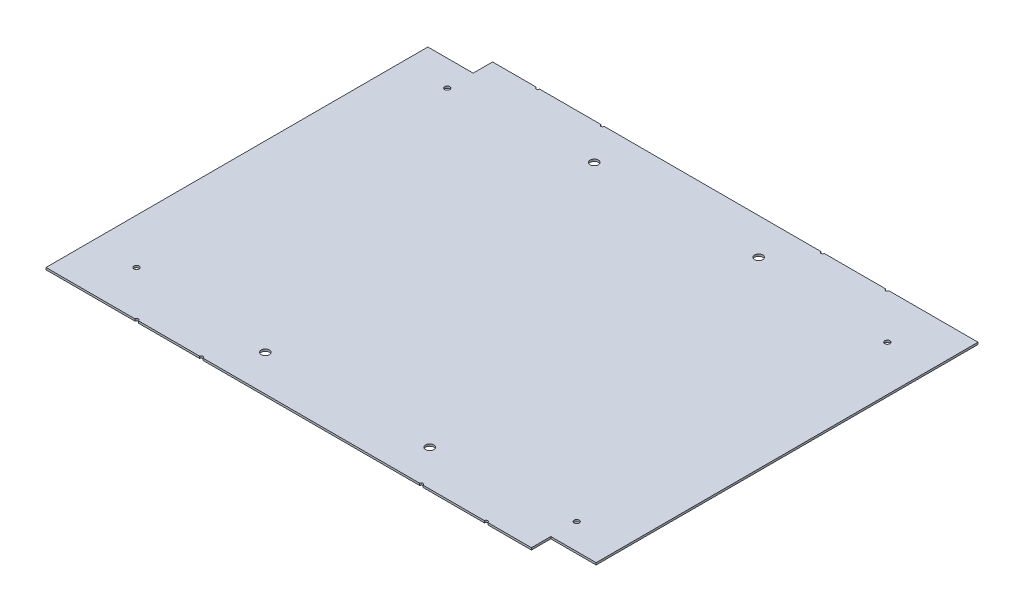
ISO-10303-21;
HEADER;
FILE_DESCRIPTION(('STEP AP214'),'2;1');
FILE_NAME('part.step','',(''),(''),'','','');
FILE_SCHEMA(('AUTOMOTIVE_DESIGN { 1 0 10303 214 1 1 1 1 }'));
ENDSEC;
DATA;
#1=APPLICATION_CONTEXT('core data for automotive mechanical design processes');
#2=APPLICATION_PROTOCOL_DEFINITION('international standard','automotive_design',2000,#1);
#3=PRODUCT_CONTEXT('',#1,'mechanical');
#4=PRODUCT('Part','Part','',(#3));
#5=PRODUCT_RELATED_PRODUCT_CATEGORY('part','',(#4));
#6=PRODUCT_DEFINITION_FORMATION('','',#4);
#7=PRODUCT_DEFINITION_CONTEXT('part definition',#1,'design');
#8=PRODUCT_DEFINITION('design','',#6,#7);
#9=PRODUCT_DEFINITION_SHAPE('','',#8);
#10=(LENGTH_UNIT() NAMED_UNIT(*) SI_UNIT(.MILLI.,.METRE.));
#11=(NAMED_UNIT(*) PLANE_ANGLE_UNIT() SI_UNIT($,.RADIAN.));
#12=(NAMED_UNIT(*) SI_UNIT($,.STERADIAN.) SOLID_ANGLE_UNIT());
#13=UNCERTAINTY_MEASURE_WITH_UNIT(LENGTH_MEASURE(1.E-05),#10,'distance_accuracy_value','');
#14=(GEOMETRIC_REPRESENTATION_CONTEXT(3) GLOBAL_UNCERTAINTY_ASSIGNED_CONTEXT((#13)) GLOBAL_UNIT_ASSIGNED_CONTEXT((#10,
#11,#12)) REPRESENTATION_CONTEXT('',''));
#15=CARTESIAN_POINT('',(0.,0.,0.));
#16=DIRECTION('',(0.,0.,1.));
#17=DIRECTION('',(1.,0.,0.));
#18=AXIS2_PLACEMENT_3D('',#15,#16,#17);
#19=CARTESIAN_POINT('',(-205.,1.5875,-155.));
#20=DIRECTION('',(0.,0.,1.));
#21=DIRECTION('',(1.,0.,0.));
#22=AXIS2_PLACEMENT_3D('',#19,#20,#21);
#23=PLANE('',#22);
#24=DIRECTION('',(-1.,0.,0.));
#25=VECTOR('',#24,1.);
#26=CARTESIAN_POINT('',(-205.,0.,-155.));
#27=LINE('',#26,#25);
#28=CARTESIAN_POINT('',(205.,0.,-155.));
#29=VERTEX_POINT('',#28);
#30=CARTESIAN_POINT('',(136.27,0.,-155.));
#31=VERTEX_POINT('',#30);
#32=EDGE_CURVE('E225',#29,#31,#27,.T.);
#33=ORIENTED_EDGE('',*,*,#32,.T.);
#34=DIRECTION('',(0.,1.,0.));
#35=VECTOR('',#34,1.);
#36=CARTESIAN_POINT('',(136.27,0.,-155.));
#37=LINE('',#36,#35);
#38=CARTESIAN_POINT('',(136.27,1.5875,-155.));
#39=VERTEX_POINT('',#38);
#40=EDGE_CURVE('E338',#31,#39,#37,.T.);
#41=ORIENTED_EDGE('',*,*,#40,.T.);
#42=DIRECTION('',(-1.,0.,0.));
#43=VECTOR('',#42,1.);
#44=CARTESIAN_POINT('',(-205.,1.5875,-155.));
#45=LINE('',#44,#43);
#46=CARTESIAN_POINT('',(205.,1.5875,-155.));
#47=VERTEX_POINT('',#46);
#48=EDGE_CURVE('E255',#47,#39,#45,.T.);
#49=ORIENTED_EDGE('',*,*,#48,.F.);
#50=DIRECTION('',(0.,-1.,0.));
#51=VECTOR('',#50,1.);
#52=CARTESIAN_POINT('',(205.,1.5875,-155.));
#53=LINE('',#52,#51);
#54=EDGE_CURVE('E11',#47,#29,#53,.T.);
#55=ORIENTED_EDGE('',*,*,#54,.T.);
#56=EDGE_LOOP('',(#33,#41,#49,#55));
#57=FACE_BOUND('',#56,.T.);
#58=ADVANCED_FACE('F39',(#57),#23,.F.);
#59=CARTESIAN_POINT('',(133.73,1.5875,-155.));
#60=VERTEX_POINT('',#59);
#61=CARTESIAN_POINT('',(86.27,1.5875,-155.));
#62=VERTEX_POINT('',#61);
#63=EDGE_CURVE('E257',#60,#62,#45,.T.);
#64=ORIENTED_EDGE('',*,*,#63,.F.);
#65=DIRECTION('',(0.,1.,0.));
#66=VECTOR('',#65,1.);
#67=CARTESIAN_POINT('',(133.73,0.,-155.));
#68=LINE('',#67,#66);
#69=CARTESIAN_POINT('',(133.73,0.,-155.));
#70=VERTEX_POINT('',#69);
#71=EDGE_CURVE('E328',#70,#60,#68,.T.);
#72=ORIENTED_EDGE('',*,*,#71,.F.);
#73=CARTESIAN_POINT('',(86.2699999999999,0.,-155.));
#74=VERTEX_POINT('',#73);
#75=EDGE_CURVE('E231',#70,#74,#27,.T.);
#76=ORIENTED_EDGE('',*,*,#75,.T.);
#77=DIRECTION('',(0.,1.,0.));
#78=VECTOR('',#77,1.);
#79=CARTESIAN_POINT('',(86.27,0.,-155.));
#80=LINE('',#79,#78);
#81=EDGE_CURVE('E348',#74,#62,#80,.T.);
#82=ORIENTED_EDGE('',*,*,#81,.T.);
#83=EDGE_LOOP('',(#64,#72,#76,#82));
#84=FACE_BOUND('',#83,.T.);
#85=ADVANCED_FACE('F485',(#84),#23,.F.);
#86=CARTESIAN_POINT('',(-86.27,0.,-155.));
#87=VERTEX_POINT('',#86);
#88=CARTESIAN_POINT('',(-133.73,0.,-155.));
#89=VERTEX_POINT('',#88);
#90=EDGE_CURVE('E420',#87,#89,#27,.T.);
#91=ORIENTED_EDGE('',*,*,#90,.T.);
#92=DIRECTION('',(0.,1.,0.));
#93=VECTOR('',#92,1.);
#94=CARTESIAN_POINT('',(-133.73,0.,-155.));
#95=LINE('',#94,#93);
#96=CARTESIAN_POINT('',(-133.73,1.5875,-155.));
#97=VERTEX_POINT('',#96);
#98=EDGE_CURVE('E357',#89,#97,#95,.T.);
#99=ORIENTED_EDGE('',*,*,#98,.T.);
#100=CARTESIAN_POINT('',(-86.27,1.5875,-155.));
#101=VERTEX_POINT('',#100);
#102=EDGE_CURVE('E778',#101,#97,#45,.T.);
#103=ORIENTED_EDGE('',*,*,#102,.F.);
#104=DIRECTION('',(0.,1.,0.));
#105=VECTOR('',#104,1.);
#106=CARTESIAN_POINT('',(-86.27,0.,-155.));
#107=LINE('',#106,#105);
#108=EDGE_CURVE('E265',#87,#101,#107,.T.);
#109=ORIENTED_EDGE('',*,*,#108,.F.);
#110=EDGE_LOOP('',(#91,#99,#103,#109));
#111=FACE_BOUND('',#110,.T.);
#112=ADVANCED_FACE('F479',(#111),#23,.F.);
#113=CARTESIAN_POINT('',(83.73,1.5875,-155.));
#114=VERTEX_POINT('',#113);
#115=CARTESIAN_POINT('',(-83.73,1.5875,-155.));
#116=VERTEX_POINT('',#115);
#117=EDGE_CURVE('E779',#114,#116,#45,.T.);
#118=ORIENTED_EDGE('',*,*,#117,.F.);
#119=DIRECTION('',(0.,1.,0.));
#120=VECTOR('',#119,1.);
#121=CARTESIAN_POINT('',(83.73,0.,-155.));
#122=LINE('',#121,#120);
#123=CARTESIAN_POINT('',(83.73,0.,-155.));
#124=VERTEX_POINT('',#123);
#125=EDGE_CURVE('E340',#124,#114,#122,.T.);
#126=ORIENTED_EDGE('',*,*,#125,.F.);
#127=CARTESIAN_POINT('',(-83.73,0.,-155.));
#128=VERTEX_POINT('',#127);
#129=EDGE_CURVE('E422',#124,#128,#27,.T.);
#130=ORIENTED_EDGE('',*,*,#129,.T.);
#131=DIRECTION('',(0.,1.,0.));
#132=VECTOR('',#131,1.);
#133=CARTESIAN_POINT('',(-83.73,0.,-155.));
#134=LINE('',#133,#132);
#135=EDGE_CURVE('E262',#128,#116,#134,.T.);
#136=ORIENTED_EDGE('',*,*,#135,.T.);
#137=EDGE_LOOP('',(#118,#126,#130,#136));
#138=FACE_BOUND('',#137,.T.);
#139=ADVANCED_FACE('F473',(#138),#23,.F.);
#140=CARTESIAN_POINT('',(-205.,1.5875,155.));
#141=DIRECTION('',(0.,0.,-1.));
#142=DIRECTION('',(-1.,0.,0.));
#143=AXIS2_PLACEMENT_3D('',#140,#141,#142);
#144=PLANE('',#143);
#145=DIRECTION('',(1.,0.,0.));
#146=VECTOR('',#145,1.);
#147=CARTESIAN_POINT('',(-205.,0.,155.));
#148=LINE('',#147,#146);
#149=CARTESIAN_POINT('',(-205.,0.,155.));
#150=VERTEX_POINT('',#149);
#151=CARTESIAN_POINT('',(-136.27,0.,155.));
#152=VERTEX_POINT('',#151);
#153=EDGE_CURVE('E223',#150,#152,#148,.T.);
#154=ORIENTED_EDGE('',*,*,#153,.T.);
#155=DIRECTION('',(0.,1.,0.));
#156=VECTOR('',#155,1.);
#157=CARTESIAN_POINT('',(-136.27,0.,155.));
#158=LINE('',#157,#156);
#159=CARTESIAN_POINT('',(-136.27,1.5875,155.));
#160=VERTEX_POINT('',#159);
#161=EDGE_CURVE('E365',#152,#160,#158,.T.);
#162=ORIENTED_EDGE('',*,*,#161,.T.);
#163=DIRECTION('',(1.,0.,0.));
#164=VECTOR('',#163,1.);
#165=CARTESIAN_POINT('',(-205.,1.5875,155.));
#166=LINE('',#165,#164);
#167=CARTESIAN_POINT('',(-205.,1.5875,155.));
#168=VERTEX_POINT('',#167);
#169=EDGE_CURVE('E237',#168,#160,#166,.T.);
#170=ORIENTED_EDGE('',*,*,#169,.F.);
#171=DIRECTION('',(0.,-1.,0.));
#172=VECTOR('',#171,1.);
#173=CARTESIAN_POINT('',(-205.,1.5875,155.));
#174=LINE('',#173,#172);
#175=EDGE_CURVE('E47',#168,#150,#174,.T.);
#176=ORIENTED_EDGE('',*,*,#175,.T.);
#177=EDGE_LOOP('',(#154,#162,#170,#176));
#178=FACE_BOUND('',#177,.T.);
#179=ADVANCED_FACE('F471',(#178),#144,.F.);
#180=CARTESIAN_POINT('',(-133.73,1.5875,155.));
#181=VERTEX_POINT('',#180);
#182=CARTESIAN_POINT('',(-86.2700000000001,1.5875,155.));
#183=VERTEX_POINT('',#182);
#184=EDGE_CURVE('E241',#181,#183,#166,.T.);
#185=ORIENTED_EDGE('',*,*,#184,.F.);
#186=DIRECTION('',(0.,1.,0.));
#187=VECTOR('',#186,1.);
#188=CARTESIAN_POINT('',(-133.73,0.,155.));
#189=LINE('',#188,#187);
#190=CARTESIAN_POINT('',(-133.73,0.,155.));
#191=VERTEX_POINT('',#190);
#192=EDGE_CURVE('E368',#191,#181,#189,.T.);
#193=ORIENTED_EDGE('',*,*,#192,.F.);
#194=CARTESIAN_POINT('',(-86.2700000000002,0.,155.));
#195=VERTEX_POINT('',#194);
#196=EDGE_CURVE('E236',#191,#195,#148,.T.);
#197=ORIENTED_EDGE('',*,*,#196,.T.);
#198=DIRECTION('',(0.,1.,0.));
#199=VECTOR('',#198,1.);
#200=CARTESIAN_POINT('',(-86.2700000000001,0.,155.));
#201=LINE('',#200,#199);
#202=EDGE_CURVE('E377',#195,#183,#201,.T.);
#203=ORIENTED_EDGE('',*,*,#202,.T.);
#204=EDGE_LOOP('',(#185,#193,#197,#203));
#205=FACE_BOUND('',#204,.T.);
#206=ADVANCED_FACE('F463',(#205),#144,.F.);
#207=CARTESIAN_POINT('',(-83.7300000000001,1.5875,155.));
#208=VERTEX_POINT('',#207);
#209=CARTESIAN_POINT('',(83.7299999999998,1.5875,155.));
#210=VERTEX_POINT('',#209);
#211=EDGE_CURVE('E247',#208,#210,#166,.T.);
#212=ORIENTED_EDGE('',*,*,#211,.F.);
#213=DIRECTION('',(0.,1.,0.));
#214=VECTOR('',#213,1.);
#215=CARTESIAN_POINT('',(-83.7300000000001,0.,155.));
#216=LINE('',#215,#214);
#217=CARTESIAN_POINT('',(-83.7300000000001,0.,155.));
#218=VERTEX_POINT('',#217);
#219=EDGE_CURVE('E367',#218,#208,#216,.T.);
#220=ORIENTED_EDGE('',*,*,#219,.F.);
#221=CARTESIAN_POINT('',(83.7299999999997,0.,155.));
#222=VERTEX_POINT('',#221);
#223=EDGE_CURVE('E455',#218,#222,#148,.T.);
#224=ORIENTED_EDGE('',*,*,#223,.T.);
#225=DIRECTION('',(0.,1.,0.));
#226=VECTOR('',#225,1.);
#227=CARTESIAN_POINT('',(83.7299999999998,0.,155.));
#228=LINE('',#227,#226);
#229=EDGE_CURVE('E386',#222,#210,#228,.T.);
#230=ORIENTED_EDGE('',*,*,#229,.T.);
#231=EDGE_LOOP('',(#212,#220,#224,#230));
#232=FACE_BOUND('',#231,.T.);
#233=ADVANCED_FACE('F468',(#232),#144,.F.);
#234=CARTESIAN_POINT('',(86.2699999999998,1.5875,155.));
#235=VERTEX_POINT('',#234);
#236=CARTESIAN_POINT('',(133.73,1.5875,155.));
#237=VERTEX_POINT('',#236);
#238=EDGE_CURVE('E250',#235,#237,#166,.T.);
#239=ORIENTED_EDGE('',*,*,#238,.F.);
#240=DIRECTION('',(0.,1.,0.));
#241=VECTOR('',#240,1.);
#242=CARTESIAN_POINT('',(86.2699999999998,0.,155.));
#243=LINE('',#242,#241);
#244=CARTESIAN_POINT('',(86.2699999999998,0.,155.));
#245=VERTEX_POINT('',#244);
#246=EDGE_CURVE('E379',#245,#235,#243,.T.);
#247=ORIENTED_EDGE('',*,*,#246,.F.);
#248=CARTESIAN_POINT('',(133.73,0.,155.));
#249=VERTEX_POINT('',#248);
#250=EDGE_CURVE('E228',#245,#249,#148,.T.);
#251=ORIENTED_EDGE('',*,*,#250,.T.);
#252=DIRECTION('',(0.,1.,0.));
#253=VECTOR('',#252,1.);
#254=CARTESIAN_POINT('',(133.73,0.,155.));
#255=LINE('',#254,#253);
#256=EDGE_CURVE('E326',#249,#237,#255,.T.);
#257=ORIENTED_EDGE('',*,*,#256,.T.);
#258=EDGE_LOOP('',(#239,#247,#251,#257));
#259=FACE_BOUND('',#258,.T.);
#260=ADVANCED_FACE('F450',(#259),#144,.F.);
#261=CARTESIAN_POINT('',(205.,1.5875,155.));
#262=DIRECTION('',(-1.,0.,0.));
#263=DIRECTION('',(0.,0.,1.));
#264=AXIS2_PLACEMENT_3D('',#261,#262,#263);
#265=PLANE('',#264);
#266=DIRECTION('',(0.,0.,-1.));
#267=VECTOR('',#266,1.);
#268=CARTESIAN_POINT('',(205.,1.5875,155.));
#269=LINE('',#268,#267);
#270=CARTESIAN_POINT('',(205.,1.5875,140.));
#271=VERTEX_POINT('',#270);
#272=EDGE_CURVE('E235',#271,#47,#269,.T.);
#273=ORIENTED_EDGE('',*,*,#272,.F.);
#274=DIRECTION('',(0.,1.,0.));
#275=VECTOR('',#274,1.);
#276=CARTESIAN_POINT('',(205.,0.,140.));
#277=LINE('',#276,#275);
#278=CARTESIAN_POINT('',(205.,0.,140.));
#279=VERTEX_POINT('',#278);
#280=EDGE_CURVE('E396',#279,#271,#277,.T.);
#281=ORIENTED_EDGE('',*,*,#280,.F.);
#282=DIRECTION('',(0.,0.,-1.));
#283=VECTOR('',#282,1.);
#284=CARTESIAN_POINT('',(205.,0.,155.));
#285=LINE('',#284,#283);
#286=EDGE_CURVE('E268',#279,#29,#285,.T.);
#287=ORIENTED_EDGE('',*,*,#286,.T.);
#288=ORIENTED_EDGE('',*,*,#54,.F.);
#289=EDGE_LOOP('',(#273,#281,#287,#288));
#290=FACE_BOUND('',#289,.T.);
#291=ADVANCED_FACE('F41',(#290),#265,.F.);
#292=CARTESIAN_POINT('',(-136.27,0.,-155.));
#293=VERTEX_POINT('',#292);
#294=CARTESIAN_POINT('',(-170.,0.,-155.));
#295=VERTEX_POINT('',#294);
#296=EDGE_CURVE('E233',#293,#295,#27,.T.);
#297=ORIENTED_EDGE('',*,*,#296,.T.);
#298=DIRECTION('',(0.,1.,0.));
#299=VECTOR('',#298,1.);
#300=CARTESIAN_POINT('',(-170.,0.,-155.));
#301=LINE('',#300,#299);
#302=CARTESIAN_POINT('',(-170.,1.5875,-155.));
#303=VERTEX_POINT('',#302);
#304=EDGE_CURVE('E370',#295,#303,#301,.T.);
#305=ORIENTED_EDGE('',*,*,#304,.T.);
#306=CARTESIAN_POINT('',(-136.27,1.5875,-155.));
#307=VERTEX_POINT('',#306);
#308=EDGE_CURVE('E259',#307,#303,#45,.T.);
#309=ORIENTED_EDGE('',*,*,#308,.F.);
#310=DIRECTION('',(0.,1.,0.));
#311=VECTOR('',#310,1.);
#312=CARTESIAN_POINT('',(-136.27,0.,-155.));
#313=LINE('',#312,#311);
#314=EDGE_CURVE('E350',#293,#307,#313,.T.);
#315=ORIENTED_EDGE('',*,*,#314,.F.);
#316=EDGE_LOOP('',(#297,#305,#309,#315));
#317=FACE_BOUND('',#316,.T.);
#318=ADVANCED_FACE('F417',(#317),#23,.F.);
#319=CARTESIAN_POINT('',(-205.,1.5875,155.));
#320=DIRECTION('',(1.,0.,0.));
#321=DIRECTION('',(0.,0.,-1.));
#322=AXIS2_PLACEMENT_3D('',#319,#320,#321);
#323=PLANE('',#322);
#324=DIRECTION('',(0.,0.,1.));
#325=VECTOR('',#324,1.);
#326=CARTESIAN_POINT('',(-205.,1.5875,155.));
#327=LINE('',#326,#325);
#328=CARTESIAN_POINT('',(-205.,1.5875,-140.));
#329=VERTEX_POINT('',#328);
#330=EDGE_CURVE('E216',#329,#168,#327,.T.);
#331=ORIENTED_EDGE('',*,*,#330,.F.);
#332=DIRECTION('',(0.,1.,0.));
#333=VECTOR('',#332,1.);
#334=CARTESIAN_POINT('',(-205.,0.,-140.));
#335=LINE('',#334,#333);
#336=CARTESIAN_POINT('',(-205.,0.,-140.));
#337=VERTEX_POINT('',#336);
#338=EDGE_CURVE('E203',#337,#329,#335,.T.);
#339=ORIENTED_EDGE('',*,*,#338,.F.);
#340=DIRECTION('',(0.,0.,1.));
#341=VECTOR('',#340,1.);
#342=CARTESIAN_POINT('',(-205.,0.,155.));
#343=LINE('',#342,#341);
#344=EDGE_CURVE('E214',#337,#150,#343,.T.);
#345=ORIENTED_EDGE('',*,*,#344,.T.);
#346=ORIENTED_EDGE('',*,*,#175,.F.);
#347=EDGE_LOOP('',(#331,#339,#345,#346));
#348=FACE_BOUND('',#347,.T.);
#349=ADVANCED_FACE('F212',(#348),#323,.F.);
#350=CARTESIAN_POINT('',(136.27,0.,155.));
#351=VERTEX_POINT('',#350);
#352=CARTESIAN_POINT('',(170.,0.,155.));
#353=VERTEX_POINT('',#352);
#354=EDGE_CURVE('E224',#351,#353,#148,.T.);
#355=ORIENTED_EDGE('',*,*,#354,.T.);
#356=DIRECTION('',(0.,1.,0.));
#357=VECTOR('',#356,1.);
#358=CARTESIAN_POINT('',(170.,0.,155.));
#359=LINE('',#358,#357);
#360=CARTESIAN_POINT('',(170.,1.5875,155.));
#361=VERTEX_POINT('',#360);
#362=EDGE_CURVE('E402',#353,#361,#359,.T.);
#363=ORIENTED_EDGE('',*,*,#362,.T.);
#364=CARTESIAN_POINT('',(136.27,1.5875,155.));
#365=VERTEX_POINT('',#364);
#366=EDGE_CURVE('E243',#365,#361,#166,.T.);
#367=ORIENTED_EDGE('',*,*,#366,.F.);
#368=DIRECTION('',(0.,1.,0.));
#369=VECTOR('',#368,1.);
#370=CARTESIAN_POINT('',(136.27,0.,155.));
#371=LINE('',#370,#369);
#372=EDGE_CURVE('E329',#351,#365,#371,.T.);
#373=ORIENTED_EDGE('',*,*,#372,.F.);
#374=EDGE_LOOP('',(#355,#363,#367,#373));
#375=FACE_BOUND('',#374,.T.);
#376=ADVANCED_FACE('F442',(#375),#144,.F.);
#377=CARTESIAN_POINT('',(0.,1.5875,0.));
#378=DIRECTION('',(0.,-1.,0.));
#379=DIRECTION('',(0.,0.,-1.));
#380=AXIS2_PLACEMENT_3D('',#377,#378,#379);
#381=PLANE('',#380);
#382=CARTESIAN_POINT('',(-63.5,1.5875,-127.06));
#383=DIRECTION('',(0.,1.,0.));
#384=DIRECTION('',(0.,0.,1.));
#385=AXIS2_PLACEMENT_3D('',#382,#383,#384);
#386=CIRCLE('',#385,3.175);
#387=CARTESIAN_POINT('',(-63.5,1.5875,-123.885));
#388=VERTEX_POINT('',#387);
#389=EDGE_CURVE('E271',#388,#388,#386,.T.);
#390=ORIENTED_EDGE('',*,*,#389,.F.);
#391=EDGE_LOOP('',(#390));
#392=FACE_BOUND('',#391,.T.);
#393=CARTESIAN_POINT('',(-170.,1.5875,-120.));
#394=DIRECTION('',(0.,1.,0.));
#395=DIRECTION('',(0.,0.,1.));
#396=AXIS2_PLACEMENT_3D('',#393,#394,#395);
#397=CIRCLE('',#396,2.);
#398=CARTESIAN_POINT('',(-170.,1.5875,-118.));
#399=VERTEX_POINT('',#398);
#400=EDGE_CURVE('E314',#399,#399,#397,.T.);
#401=ORIENTED_EDGE('',*,*,#400,.F.);
#402=EDGE_LOOP('',(#401));
#403=FACE_BOUND('',#402,.T.);
#404=CARTESIAN_POINT('',(63.5,1.5875,-127.06));
#405=DIRECTION('',(0.,1.,0.));
#406=DIRECTION('',(0.,0.,-1.));
#407=AXIS2_PLACEMENT_3D('',#404,#405,#406);
#408=CIRCLE('',#407,3.175);
#409=CARTESIAN_POINT('',(63.5,1.5875,-130.235));
#410=VERTEX_POINT('',#409);
#411=EDGE_CURVE('E308',#410,#410,#408,.T.);
#412=ORIENTED_EDGE('',*,*,#411,.F.);
#413=EDGE_LOOP('',(#412));
#414=FACE_BOUND('',#413,.T.);
#415=CARTESIAN_POINT('',(170.,1.5875,-120.));
#416=DIRECTION('',(0.,1.,0.));
#417=DIRECTION('',(0.,0.,-1.));
#418=AXIS2_PLACEMENT_3D('',#415,#416,#417);
#419=CIRCLE('',#418,2.);
#420=CARTESIAN_POINT('',(170.,1.5875,-122.));
#421=VERTEX_POINT('',#420);
#422=EDGE_CURVE('E302',#421,#421,#419,.T.);
#423=ORIENTED_EDGE('',*,*,#422,.F.);
#424=EDGE_LOOP('',(#423));
#425=FACE_BOUND('',#424,.T.);
#426=CARTESIAN_POINT('',(170.,1.5875,120.));
#427=DIRECTION('',(0.,1.,0.));
#428=DIRECTION('',(0.,0.,1.));
#429=AXIS2_PLACEMENT_3D('',#426,#427,#428);
#430=CIRCLE('',#429,2.);
#431=CARTESIAN_POINT('',(170.,1.5875,122.));
#432=VERTEX_POINT('',#431);
#433=EDGE_CURVE('E296',#432,#432,#430,.T.);
#434=ORIENTED_EDGE('',*,*,#433,.F.);
#435=EDGE_LOOP('',(#434));
#436=FACE_BOUND('',#435,.T.);
#437=CARTESIAN_POINT('',(63.5,1.5875,127.06));
#438=DIRECTION('',(0.,1.,0.));
#439=DIRECTION('',(0.,0.,1.));
#440=AXIS2_PLACEMENT_3D('',#437,#438,#439);
#441=CIRCLE('',#440,3.175);
#442=CARTESIAN_POINT('',(63.5,1.5875,130.235));
#443=VERTEX_POINT('',#442);
#444=EDGE_CURVE('E290',#443,#443,#441,.T.);
#445=ORIENTED_EDGE('',*,*,#444,.F.);
#446=EDGE_LOOP('',(#445));
#447=FACE_BOUND('',#446,.T.);
#448=CARTESIAN_POINT('',(-63.5,1.5875,127.06));
#449=DIRECTION('',(0.,1.,0.));
#450=DIRECTION('',(0.,0.,-1.));
#451=AXIS2_PLACEMENT_3D('',#448,#449,#450);
#452=CIRCLE('',#451,3.175);
#453=CARTESIAN_POINT('',(-63.5,1.5875,123.885));
#454=VERTEX_POINT('',#453);
#455=EDGE_CURVE('E284',#454,#454,#452,.T.);
#456=ORIENTED_EDGE('',*,*,#455,.F.);
#457=EDGE_LOOP('',(#456));
#458=FACE_BOUND('',#457,.T.);
#459=CARTESIAN_POINT('',(-170.,1.5875,120.));
#460=DIRECTION('',(0.,1.,0.));
#461=DIRECTION('',(0.,0.,-1.));
#462=AXIS2_PLACEMENT_3D('',#459,#460,#461);
#463=CIRCLE('',#462,2.);
#464=CARTESIAN_POINT('',(-170.,1.5875,118.));
#465=VERTEX_POINT('',#464);
#466=EDGE_CURVE('E277',#465,#465,#463,.T.);
#467=ORIENTED_EDGE('',*,*,#466,.F.);
#468=EDGE_LOOP('',(#467));
#469=FACE_BOUND('',#468,.T.);
#470=ORIENTED_EDGE('',*,*,#308,.T.);
#471=DIRECTION('',(0.,0.,-1.));
#472=VECTOR('',#471,1.);
#473=CARTESIAN_POINT('',(-170.,1.5875,-155.));
#474=LINE('',#473,#472);
#475=CARTESIAN_POINT('',(-170.,1.5875,-140.));
#476=VERTEX_POINT('',#475);
#477=EDGE_CURVE('E208',#476,#303,#474,.T.);
#478=ORIENTED_EDGE('',*,*,#477,.F.);
#479=DIRECTION('',(1.,0.,0.));
#480=VECTOR('',#479,1.);
#481=CARTESIAN_POINT('',(-205.,1.5875,-140.));
#482=LINE('',#481,#480);
#483=EDGE_CURVE('E400',#329,#476,#482,.T.);
#484=ORIENTED_EDGE('',*,*,#483,.F.);
#485=ORIENTED_EDGE('',*,*,#330,.T.);
#486=ORIENTED_EDGE('',*,*,#169,.T.);
#487=CARTESIAN_POINT('',(-135.,1.5875,155.));
#488=DIRECTION('',(0.,1.,0.));
#489=DIRECTION('',(0.,0.,1.));
#490=AXIS2_PLACEMENT_3D('',#487,#488,#489);
#491=CIRCLE('',#490,1.26999999999999);
#492=EDGE_CURVE('E364',#181,#160,#491,.T.);
#493=ORIENTED_EDGE('',*,*,#492,.F.);
#494=ORIENTED_EDGE('',*,*,#184,.T.);
#495=CARTESIAN_POINT('',(-85.0000000000001,1.5875,155.));
#496=DIRECTION('',(0.,1.,0.));
#497=DIRECTION('',(0.,0.,1.));
#498=AXIS2_PLACEMENT_3D('',#495,#496,#497);
#499=CIRCLE('',#498,1.27000000000001);
#500=EDGE_CURVE('E376',#208,#183,#499,.T.);
#501=ORIENTED_EDGE('',*,*,#500,.F.);
#502=ORIENTED_EDGE('',*,*,#211,.T.);
#503=CARTESIAN_POINT('',(84.9999999999998,1.5875,155.));
#504=DIRECTION('',(0.,1.,0.));
#505=DIRECTION('',(0.,0.,-1.));
#506=AXIS2_PLACEMENT_3D('',#503,#504,#505);
#507=CIRCLE('',#506,1.27000000000001);
#508=EDGE_CURVE('E331',#235,#210,#507,.T.);
#509=ORIENTED_EDGE('',*,*,#508,.F.);
#510=ORIENTED_EDGE('',*,*,#238,.T.);
#511=CARTESIAN_POINT('',(135.,1.5875,155.));
#512=DIRECTION('',(0.,1.,0.));
#513=DIRECTION('',(0.,0.,-1.));
#514=AXIS2_PLACEMENT_3D('',#511,#512,#513);
#515=CIRCLE('',#514,1.26999999999999);
#516=EDGE_CURVE('E325',#365,#237,#515,.T.);
#517=ORIENTED_EDGE('',*,*,#516,.F.);
#518=ORIENTED_EDGE('',*,*,#366,.T.);
#519=DIRECTION('',(0.,0.,1.));
#520=VECTOR('',#519,1.);
#521=CARTESIAN_POINT('',(170.,1.5875,155.));
#522=LINE('',#521,#520);
#523=CARTESIAN_POINT('',(170.,1.5875,140.));
#524=VERTEX_POINT('',#523);
#525=EDGE_CURVE('E394',#524,#361,#522,.T.);
#526=ORIENTED_EDGE('',*,*,#525,.F.);
#527=DIRECTION('',(-1.,0.,0.));
#528=VECTOR('',#527,1.);
#529=CARTESIAN_POINT('',(205.,1.5875,140.));
#530=LINE('',#529,#528);
#531=EDGE_CURVE('E397',#271,#524,#530,.T.);
#532=ORIENTED_EDGE('',*,*,#531,.F.);
#533=ORIENTED_EDGE('',*,*,#272,.T.);
#534=ORIENTED_EDGE('',*,*,#48,.T.);
#535=CARTESIAN_POINT('',(135.,1.5875,-155.));
#536=DIRECTION('',(0.,1.,0.));
#537=DIRECTION('',(0.,0.,1.));
#538=AXIS2_PLACEMENT_3D('',#535,#536,#537);
#539=CIRCLE('',#538,1.26999999999999);
#540=EDGE_CURVE('E337',#60,#39,#539,.T.);
#541=ORIENTED_EDGE('',*,*,#540,.F.);
#542=ORIENTED_EDGE('',*,*,#63,.T.);
#543=CARTESIAN_POINT('',(85.,1.5875,-155.));
#544=DIRECTION('',(0.,1.,0.));
#545=DIRECTION('',(0.,0.,1.));
#546=AXIS2_PLACEMENT_3D('',#543,#544,#545);
#547=CIRCLE('',#546,1.27000000000001);
#548=EDGE_CURVE('E347',#114,#62,#547,.T.);
#549=ORIENTED_EDGE('',*,*,#548,.F.);
#550=ORIENTED_EDGE('',*,*,#117,.T.);
#551=CARTESIAN_POINT('',(-85.,1.5875,-155.));
#552=DIRECTION('',(0.,1.,0.));
#553=DIRECTION('',(0.,0.,-1.));
#554=AXIS2_PLACEMENT_3D('',#551,#552,#553);
#555=CIRCLE('',#554,1.27000000000001);
#556=EDGE_CURVE('E269',#101,#116,#555,.T.);
#557=ORIENTED_EDGE('',*,*,#556,.F.);
#558=ORIENTED_EDGE('',*,*,#102,.T.);
#559=CARTESIAN_POINT('',(-135.,1.5875,-155.));
#560=DIRECTION('',(0.,1.,0.));
#561=DIRECTION('',(0.,0.,-1.));
#562=AXIS2_PLACEMENT_3D('',#559,#560,#561);
#563=CIRCLE('',#562,1.26999999999999);
#564=EDGE_CURVE('E278',#307,#97,#563,.T.);
#565=ORIENTED_EDGE('',*,*,#564,.F.);
#566=EDGE_LOOP('',(#470,#478,#484,#485,#486,#493,#494,#501,#502,#509,#510,#517,#518,#526,#532,
#533,#534,#541,#542,#549,#550,#557,#558,#565));
#567=FACE_BOUND('',#566,.T.);
#568=ADVANCED_FACE('F433',(#392,#403,#414,#425,#436,#447,#458,#469,#567),#381,.F.);
#569=CARTESIAN_POINT('',(0.,0.,0.));
#570=DIRECTION('',(0.,-1.,0.));
#571=DIRECTION('',(0.,0.,-1.));
#572=AXIS2_PLACEMENT_3D('',#569,#570,#571);
#573=PLANE('',#572);
#574=DIRECTION('',(0.,0.,-1.));
#575=VECTOR('',#574,1.);
#576=CARTESIAN_POINT('',(-170.,0.,-155.));
#577=LINE('',#576,#575);
#578=CARTESIAN_POINT('',(-170.,0.,-140.));
#579=VERTEX_POINT('',#578);
#580=EDGE_CURVE('E54',#579,#295,#577,.T.);
#581=ORIENTED_EDGE('',*,*,#580,.T.);
#582=ORIENTED_EDGE('',*,*,#296,.F.);
#583=CARTESIAN_POINT('',(-135.,0.,-155.));
#584=DIRECTION('',(0.,1.,0.));
#585=DIRECTION('',(0.,0.,-1.));
#586=AXIS2_PLACEMENT_3D('',#583,#584,#585);
#587=CIRCLE('',#586,1.26999999999999);
#588=EDGE_CURVE('E354',#293,#89,#587,.T.);
#589=ORIENTED_EDGE('',*,*,#588,.T.);
#590=ORIENTED_EDGE('',*,*,#90,.F.);
#591=CARTESIAN_POINT('',(-85.,0.,-155.));
#592=DIRECTION('',(0.,1.,0.));
#593=DIRECTION('',(0.,0.,-1.));
#594=AXIS2_PLACEMENT_3D('',#591,#592,#593);
#595=CIRCLE('',#594,1.27000000000001);
#596=EDGE_CURVE('E266',#87,#128,#595,.T.);
#597=ORIENTED_EDGE('',*,*,#596,.T.);
#598=ORIENTED_EDGE('',*,*,#129,.F.);
#599=CARTESIAN_POINT('',(85.,0.,-155.));
#600=DIRECTION('',(0.,1.,0.));
#601=DIRECTION('',(0.,0.,1.));
#602=AXIS2_PLACEMENT_3D('',#599,#600,#601);
#603=CIRCLE('',#602,1.27000000000001);
#604=EDGE_CURVE('E344',#124,#74,#603,.T.);
#605=ORIENTED_EDGE('',*,*,#604,.T.);
#606=ORIENTED_EDGE('',*,*,#75,.F.);
#607=CARTESIAN_POINT('',(135.,0.,-155.));
#608=DIRECTION('',(0.,1.,0.));
#609=DIRECTION('',(0.,0.,1.));
#610=AXIS2_PLACEMENT_3D('',#607,#608,#609);
#611=CIRCLE('',#610,1.26999999999999);
#612=EDGE_CURVE('E334',#70,#31,#611,.T.);
#613=ORIENTED_EDGE('',*,*,#612,.T.);
#614=ORIENTED_EDGE('',*,*,#32,.F.);
#615=ORIENTED_EDGE('',*,*,#286,.F.);
#616=DIRECTION('',(-1.,0.,0.));
#617=VECTOR('',#616,1.);
#618=CARTESIAN_POINT('',(205.,0.,140.));
#619=LINE('',#618,#617);
#620=CARTESIAN_POINT('',(170.,0.,140.));
#621=VERTEX_POINT('',#620);
#622=EDGE_CURVE('E391',#279,#621,#619,.T.);
#623=ORIENTED_EDGE('',*,*,#622,.T.);
#624=DIRECTION('',(0.,0.,1.));
#625=VECTOR('',#624,1.);
#626=CARTESIAN_POINT('',(170.,0.,155.));
#627=LINE('',#626,#625);
#628=EDGE_CURVE('E62',#621,#353,#627,.T.);
#629=ORIENTED_EDGE('',*,*,#628,.T.);
#630=ORIENTED_EDGE('',*,*,#354,.F.);
#631=CARTESIAN_POINT('',(135.,0.,155.));
#632=DIRECTION('',(0.,1.,0.));
#633=DIRECTION('',(0.,0.,-1.));
#634=AXIS2_PLACEMENT_3D('',#631,#632,#633);
#635=CIRCLE('',#634,1.26999999999999);
#636=EDGE_CURVE('E322',#351,#249,#635,.T.);
#637=ORIENTED_EDGE('',*,*,#636,.T.);
#638=ORIENTED_EDGE('',*,*,#250,.F.);
#639=CARTESIAN_POINT('',(84.9999999999998,0.,155.));
#640=DIRECTION('',(0.,1.,0.));
#641=DIRECTION('',(0.,0.,-1.));
#642=AXIS2_PLACEMENT_3D('',#639,#640,#641);
#643=CIRCLE('',#642,1.27000000000001);
#644=EDGE_CURVE('E383',#245,#222,#643,.T.);
#645=ORIENTED_EDGE('',*,*,#644,.T.);
#646=ORIENTED_EDGE('',*,*,#223,.F.);
#647=CARTESIAN_POINT('',(-85.0000000000001,0.,155.));
#648=DIRECTION('',(0.,1.,0.));
#649=DIRECTION('',(0.,0.,1.));
#650=AXIS2_PLACEMENT_3D('',#647,#648,#649);
#651=CIRCLE('',#650,1.27000000000001);
#652=EDGE_CURVE('E373',#218,#195,#651,.T.);
#653=ORIENTED_EDGE('',*,*,#652,.T.);
#654=ORIENTED_EDGE('',*,*,#196,.F.);
#655=CARTESIAN_POINT('',(-135.,0.,155.));
#656=DIRECTION('',(0.,1.,0.));
#657=DIRECTION('',(0.,0.,1.));
#658=AXIS2_PLACEMENT_3D('',#655,#656,#657);
#659=CIRCLE('',#658,1.26999999999999);
#660=EDGE_CURVE('E362',#191,#152,#659,.T.);
#661=ORIENTED_EDGE('',*,*,#660,.T.);
#662=ORIENTED_EDGE('',*,*,#153,.F.);
#663=ORIENTED_EDGE('',*,*,#344,.F.);
#664=DIRECTION('',(1.,0.,0.));
#665=VECTOR('',#664,1.);
#666=CARTESIAN_POINT('',(-205.,0.,-140.));
#667=LINE('',#666,#665);
#668=EDGE_CURVE('E199',#337,#579,#667,.T.);
#669=ORIENTED_EDGE('',*,*,#668,.T.);
#670=EDGE_LOOP('',(#581,#582,#589,#590,#597,#598,#605,#606,#613,#614,#615,#623,#629,#630,#637,
#638,#645,#646,#653,#654,#661,#662,#663,#669));
#671=FACE_BOUND('',#670,.T.);
#672=CARTESIAN_POINT('',(-63.5,0.,-127.06));
#673=DIRECTION('',(0.,1.,0.));
#674=DIRECTION('',(0.,0.,1.));
#675=AXIS2_PLACEMENT_3D('',#672,#673,#674);
#676=CIRCLE('',#675,3.175);
#677=CARTESIAN_POINT('',(-63.5,0.,-123.885));
#678=VERTEX_POINT('',#677);
#679=EDGE_CURVE('E317',#678,#678,#676,.T.);
#680=ORIENTED_EDGE('',*,*,#679,.T.);
#681=EDGE_LOOP('',(#680));
#682=FACE_BOUND('',#681,.T.);
#683=CARTESIAN_POINT('',(-170.,0.,-120.));
#684=DIRECTION('',(0.,1.,0.));
#685=DIRECTION('',(0.,0.,1.));
#686=AXIS2_PLACEMENT_3D('',#683,#684,#685);
#687=CIRCLE('',#686,2.);
#688=CARTESIAN_POINT('',(-170.,0.,-118.));
#689=VERTEX_POINT('',#688);
#690=EDGE_CURVE('E311',#689,#689,#687,.T.);
#691=ORIENTED_EDGE('',*,*,#690,.T.);
#692=EDGE_LOOP('',(#691));
#693=FACE_BOUND('',#692,.T.);
#694=CARTESIAN_POINT('',(63.5,0.,-127.06));
#695=DIRECTION('',(0.,1.,0.));
#696=DIRECTION('',(0.,0.,-1.));
#697=AXIS2_PLACEMENT_3D('',#694,#695,#696);
#698=CIRCLE('',#697,3.175);
#699=CARTESIAN_POINT('',(63.5,0.,-130.235));
#700=VERTEX_POINT('',#699);
#701=EDGE_CURVE('E305',#700,#700,#698,.T.);
#702=ORIENTED_EDGE('',*,*,#701,.T.);
#703=EDGE_LOOP('',(#702));
#704=FACE_BOUND('',#703,.T.);
#705=CARTESIAN_POINT('',(170.,0.,-120.));
#706=DIRECTION('',(0.,1.,0.));
#707=DIRECTION('',(0.,0.,-1.));
#708=AXIS2_PLACEMENT_3D('',#705,#706,#707);
#709=CIRCLE('',#708,2.);
#710=CARTESIAN_POINT('',(170.,0.,-122.));
#711=VERTEX_POINT('',#710);
#712=EDGE_CURVE('E299',#711,#711,#709,.T.);
#713=ORIENTED_EDGE('',*,*,#712,.T.);
#714=EDGE_LOOP('',(#713));
#715=FACE_BOUND('',#714,.T.);
#716=CARTESIAN_POINT('',(170.,0.,120.));
#717=DIRECTION('',(0.,1.,0.));
#718=DIRECTION('',(0.,0.,1.));
#719=AXIS2_PLACEMENT_3D('',#716,#717,#718);
#720=CIRCLE('',#719,2.);
#721=CARTESIAN_POINT('',(170.,0.,122.));
#722=VERTEX_POINT('',#721);
#723=EDGE_CURVE('E293',#722,#722,#720,.T.);
#724=ORIENTED_EDGE('',*,*,#723,.T.);
#725=EDGE_LOOP('',(#724));
#726=FACE_BOUND('',#725,.T.);
#727=CARTESIAN_POINT('',(63.5,0.,127.06));
#728=DIRECTION('',(0.,1.,0.));
#729=DIRECTION('',(0.,0.,1.));
#730=AXIS2_PLACEMENT_3D('',#727,#728,#729);
#731=CIRCLE('',#730,3.175);
#732=CARTESIAN_POINT('',(63.5,0.,130.235));
#733=VERTEX_POINT('',#732);
#734=EDGE_CURVE('E287',#733,#733,#731,.T.);
#735=ORIENTED_EDGE('',*,*,#734,.T.);
#736=EDGE_LOOP('',(#735));
#737=FACE_BOUND('',#736,.T.);
#738=CARTESIAN_POINT('',(-63.5,0.,127.06));
#739=DIRECTION('',(0.,1.,0.));
#740=DIRECTION('',(0.,0.,-1.));
#741=AXIS2_PLACEMENT_3D('',#738,#739,#740);
#742=CIRCLE('',#741,3.175);
#743=CARTESIAN_POINT('',(-63.5,0.,123.885));
#744=VERTEX_POINT('',#743);
#745=EDGE_CURVE('E281',#744,#744,#742,.T.);
#746=ORIENTED_EDGE('',*,*,#745,.T.);
#747=EDGE_LOOP('',(#746));
#748=FACE_BOUND('',#747,.T.);
#749=CARTESIAN_POINT('',(-170.,0.,120.));
#750=DIRECTION('',(0.,1.,0.));
#751=DIRECTION('',(0.,0.,-1.));
#752=AXIS2_PLACEMENT_3D('',#749,#750,#751);
#753=CIRCLE('',#752,2.);
#754=CARTESIAN_POINT('',(-170.,0.,118.));
#755=VERTEX_POINT('',#754);
#756=EDGE_CURVE('E274',#755,#755,#753,.T.);
#757=ORIENTED_EDGE('',*,*,#756,.T.);
#758=EDGE_LOOP('',(#757));
#759=FACE_BOUND('',#758,.T.);
#760=ADVANCED_FACE('F219',(#671,#682,#693,#704,#715,#726,#737,#748,#759),#573,.T.);
#761=CARTESIAN_POINT('',(-85.,0.,-155.));
#762=DIRECTION('',(0.,1.,0.));
#763=DIRECTION('',(0.,0.,1.));
#764=AXIS2_PLACEMENT_3D('',#761,#762,#763);
#765=CYLINDRICAL_SURFACE('',#764,1.27000000000001);
#766=ORIENTED_EDGE('',*,*,#556,.T.);
#767=ORIENTED_EDGE('',*,*,#135,.F.);
#768=ORIENTED_EDGE('',*,*,#596,.F.);
#769=ORIENTED_EDGE('',*,*,#108,.T.);
#770=EDGE_LOOP('',(#766,#767,#768,#769));
#771=FACE_BOUND('',#770,.T.);
#772=ADVANCED_FACE('F545',(#771),#765,.F.);
#773=CARTESIAN_POINT('',(-135.,0.,-155.));
#774=DIRECTION('',(0.,1.,0.));
#775=DIRECTION('',(0.,0.,1.));
#776=AXIS2_PLACEMENT_3D('',#773,#774,#775);
#777=CYLINDRICAL_SURFACE('',#776,1.26999999999999);
#778=ORIENTED_EDGE('',*,*,#564,.T.);
#779=ORIENTED_EDGE('',*,*,#98,.F.);
#780=ORIENTED_EDGE('',*,*,#588,.F.);
#781=ORIENTED_EDGE('',*,*,#314,.T.);
#782=EDGE_LOOP('',(#778,#779,#780,#781));
#783=FACE_BOUND('',#782,.T.);
#784=ADVANCED_FACE('F548',(#783),#777,.F.);
#785=CARTESIAN_POINT('',(85.,0.,-155.));
#786=DIRECTION('',(0.,1.,0.));
#787=DIRECTION('',(0.,0.,1.));
#788=AXIS2_PLACEMENT_3D('',#785,#786,#787);
#789=CYLINDRICAL_SURFACE('',#788,1.27000000000001);
#790=ORIENTED_EDGE('',*,*,#548,.T.);
#791=ORIENTED_EDGE('',*,*,#81,.F.);
#792=ORIENTED_EDGE('',*,*,#604,.F.);
#793=ORIENTED_EDGE('',*,*,#125,.T.);
#794=EDGE_LOOP('',(#790,#791,#792,#793));
#795=FACE_BOUND('',#794,.T.);
#796=ADVANCED_FACE('F557',(#795),#789,.F.);
#797=CARTESIAN_POINT('',(135.,0.,-155.));
#798=DIRECTION('',(0.,1.,0.));
#799=DIRECTION('',(0.,0.,1.));
#800=AXIS2_PLACEMENT_3D('',#797,#798,#799);
#801=CYLINDRICAL_SURFACE('',#800,1.26999999999999);
#802=ORIENTED_EDGE('',*,*,#540,.T.);
#803=ORIENTED_EDGE('',*,*,#40,.F.);
#804=ORIENTED_EDGE('',*,*,#612,.F.);
#805=ORIENTED_EDGE('',*,*,#71,.T.);
#806=EDGE_LOOP('',(#802,#803,#804,#805));
#807=FACE_BOUND('',#806,.T.);
#808=ADVANCED_FACE('F566',(#807),#801,.F.);
#809=CARTESIAN_POINT('',(135.,0.,155.));
#810=DIRECTION('',(0.,1.,0.));
#811=DIRECTION('',(0.,0.,1.));
#812=AXIS2_PLACEMENT_3D('',#809,#810,#811);
#813=CYLINDRICAL_SURFACE('',#812,1.26999999999999);
#814=ORIENTED_EDGE('',*,*,#516,.T.);
#815=ORIENTED_EDGE('',*,*,#256,.F.);
#816=ORIENTED_EDGE('',*,*,#636,.F.);
#817=ORIENTED_EDGE('',*,*,#372,.T.);
#818=EDGE_LOOP('',(#814,#815,#816,#817));
#819=FACE_BOUND('',#818,.T.);
#820=ADVANCED_FACE('F444',(#819),#813,.F.);
#821=CARTESIAN_POINT('',(84.9999999999998,0.,155.));
#822=DIRECTION('',(0.,1.,0.));
#823=DIRECTION('',(0.,0.,1.));
#824=AXIS2_PLACEMENT_3D('',#821,#822,#823);
#825=CYLINDRICAL_SURFACE('',#824,1.27000000000001);
#826=ORIENTED_EDGE('',*,*,#508,.T.);
#827=ORIENTED_EDGE('',*,*,#229,.F.);
#828=ORIENTED_EDGE('',*,*,#644,.F.);
#829=ORIENTED_EDGE('',*,*,#246,.T.);
#830=EDGE_LOOP('',(#826,#827,#828,#829));
#831=FACE_BOUND('',#830,.T.);
#832=ADVANCED_FACE('F583',(#831),#825,.F.);
#833=CARTESIAN_POINT('',(-85.0000000000001,0.,155.));
#834=DIRECTION('',(0.,1.,0.));
#835=DIRECTION('',(0.,0.,1.));
#836=AXIS2_PLACEMENT_3D('',#833,#834,#835);
#837=CYLINDRICAL_SURFACE('',#836,1.27000000000001);
#838=ORIENTED_EDGE('',*,*,#500,.T.);
#839=ORIENTED_EDGE('',*,*,#202,.F.);
#840=ORIENTED_EDGE('',*,*,#652,.F.);
#841=ORIENTED_EDGE('',*,*,#219,.T.);
#842=EDGE_LOOP('',(#838,#839,#840,#841));
#843=FACE_BOUND('',#842,.T.);
#844=ADVANCED_FACE('F465',(#843),#837,.F.);
#845=CARTESIAN_POINT('',(-135.,0.,155.));
#846=DIRECTION('',(0.,1.,0.));
#847=DIRECTION('',(0.,0.,1.));
#848=AXIS2_PLACEMENT_3D('',#845,#846,#847);
#849=CYLINDRICAL_SURFACE('',#848,1.26999999999999);
#850=ORIENTED_EDGE('',*,*,#492,.T.);
#851=ORIENTED_EDGE('',*,*,#161,.F.);
#852=ORIENTED_EDGE('',*,*,#660,.F.);
#853=ORIENTED_EDGE('',*,*,#192,.T.);
#854=EDGE_LOOP('',(#850,#851,#852,#853));
#855=FACE_BOUND('',#854,.T.);
#856=ADVANCED_FACE('F470',(#855),#849,.F.);
#857=CARTESIAN_POINT('',(-170.,0.,120.));
#858=DIRECTION('',(0.,1.,0.));
#859=DIRECTION('',(0.,0.,1.));
#860=AXIS2_PLACEMENT_3D('',#857,#858,#859);
#861=CYLINDRICAL_SURFACE('',#860,2.);
#862=ORIENTED_EDGE('',*,*,#756,.F.);
#863=EDGE_LOOP('',(#862));
#864=FACE_BOUND('',#863,.T.);
#865=ORIENTED_EDGE('',*,*,#466,.T.);
#866=EDGE_LOOP('',(#865));
#867=FACE_BOUND('',#866,.T.);
#868=ADVANCED_FACE('F606',(#864,#867),#861,.F.);
#869=CARTESIAN_POINT('',(-63.5,0.,127.06));
#870=DIRECTION('',(0.,1.,0.));
#871=DIRECTION('',(0.,0.,1.));
#872=AXIS2_PLACEMENT_3D('',#869,#870,#871);
#873=CYLINDRICAL_SURFACE('',#872,3.175);
#874=ORIENTED_EDGE('',*,*,#745,.F.);
#875=EDGE_LOOP('',(#874));
#876=FACE_BOUND('',#875,.T.);
#877=ORIENTED_EDGE('',*,*,#455,.T.);
#878=EDGE_LOOP('',(#877));
#879=FACE_BOUND('',#878,.T.);
#880=ADVANCED_FACE('F614',(#876,#879),#873,.F.);
#881=CARTESIAN_POINT('',(63.5,0.,127.06));
#882=DIRECTION('',(0.,1.,0.));
#883=DIRECTION('',(0.,0.,1.));
#884=AXIS2_PLACEMENT_3D('',#881,#882,#883);
#885=CYLINDRICAL_SURFACE('',#884,3.175);
#886=ORIENTED_EDGE('',*,*,#734,.F.);
#887=EDGE_LOOP('',(#886));
#888=FACE_BOUND('',#887,.T.);
#889=ORIENTED_EDGE('',*,*,#444,.T.);
#890=EDGE_LOOP('',(#889));
#891=FACE_BOUND('',#890,.T.);
#892=ADVANCED_FACE('F623',(#888,#891),#885,.F.);
#893=CARTESIAN_POINT('',(170.,0.,120.));
#894=DIRECTION('',(0.,1.,0.));
#895=DIRECTION('',(0.,0.,1.));
#896=AXIS2_PLACEMENT_3D('',#893,#894,#895);
#897=CYLINDRICAL_SURFACE('',#896,2.);
#898=ORIENTED_EDGE('',*,*,#723,.F.);
#899=EDGE_LOOP('',(#898));
#900=FACE_BOUND('',#899,.T.);
#901=ORIENTED_EDGE('',*,*,#433,.T.);
#902=EDGE_LOOP('',(#901));
#903=FACE_BOUND('',#902,.T.);
#904=ADVANCED_FACE('F632',(#900,#903),#897,.F.);
#905=CARTESIAN_POINT('',(170.,0.,-120.));
#906=DIRECTION('',(0.,1.,0.));
#907=DIRECTION('',(0.,0.,1.));
#908=AXIS2_PLACEMENT_3D('',#905,#906,#907);
#909=CYLINDRICAL_SURFACE('',#908,2.);
#910=ORIENTED_EDGE('',*,*,#712,.F.);
#911=EDGE_LOOP('',(#910));
#912=FACE_BOUND('',#911,.T.);
#913=ORIENTED_EDGE('',*,*,#422,.T.);
#914=EDGE_LOOP('',(#913));
#915=FACE_BOUND('',#914,.T.);
#916=ADVANCED_FACE('F641',(#912,#915),#909,.F.);
#917=CARTESIAN_POINT('',(63.5,0.,-127.06));
#918=DIRECTION('',(0.,1.,0.));
#919=DIRECTION('',(0.,0.,1.));
#920=AXIS2_PLACEMENT_3D('',#917,#918,#919);
#921=CYLINDRICAL_SURFACE('',#920,3.175);
#922=ORIENTED_EDGE('',*,*,#701,.F.);
#923=EDGE_LOOP('',(#922));
#924=FACE_BOUND('',#923,.T.);
#925=ORIENTED_EDGE('',*,*,#411,.T.);
#926=EDGE_LOOP('',(#925));
#927=FACE_BOUND('',#926,.T.);
#928=ADVANCED_FACE('F650',(#924,#927),#921,.F.);
#929=CARTESIAN_POINT('',(-170.,0.,-120.));
#930=DIRECTION('',(0.,1.,0.));
#931=DIRECTION('',(0.,0.,1.));
#932=AXIS2_PLACEMENT_3D('',#929,#930,#931);
#933=CYLINDRICAL_SURFACE('',#932,2.);
#934=ORIENTED_EDGE('',*,*,#690,.F.);
#935=EDGE_LOOP('',(#934));
#936=FACE_BOUND('',#935,.T.);
#937=ORIENTED_EDGE('',*,*,#400,.T.);
#938=EDGE_LOOP('',(#937));
#939=FACE_BOUND('',#938,.T.);
#940=ADVANCED_FACE('F659',(#936,#939),#933,.F.);
#941=CARTESIAN_POINT('',(-63.5,0.,-127.06));
#942=DIRECTION('',(0.,1.,0.));
#943=DIRECTION('',(0.,0.,1.));
#944=AXIS2_PLACEMENT_3D('',#941,#942,#943);
#945=CYLINDRICAL_SURFACE('',#944,3.175);
#946=ORIENTED_EDGE('',*,*,#679,.F.);
#947=EDGE_LOOP('',(#946));
#948=FACE_BOUND('',#947,.T.);
#949=ORIENTED_EDGE('',*,*,#389,.T.);
#950=EDGE_LOOP('',(#949));
#951=FACE_BOUND('',#950,.T.);
#952=ADVANCED_FACE('F668',(#948,#951),#945,.F.);
#953=CARTESIAN_POINT('',(170.,0.,155.));
#954=DIRECTION('',(-1.,0.,0.));
#955=DIRECTION('',(0.,0.,1.));
#956=AXIS2_PLACEMENT_3D('',#953,#954,#955);
#957=PLANE('',#956);
#958=ORIENTED_EDGE('',*,*,#525,.T.);
#959=ORIENTED_EDGE('',*,*,#362,.F.);
#960=ORIENTED_EDGE('',*,*,#628,.F.);
#961=DIRECTION('',(0.,1.,0.));
#962=VECTOR('',#961,1.);
#963=CARTESIAN_POINT('',(170.,0.,140.));
#964=LINE('',#963,#962);
#965=EDGE_CURVE('E405',#621,#524,#964,.T.);
#966=ORIENTED_EDGE('',*,*,#965,.T.);
#967=EDGE_LOOP('',(#958,#959,#960,#966));
#968=FACE_BOUND('',#967,.T.);
#969=ADVANCED_FACE('F676',(#968),#957,.F.);
#970=CARTESIAN_POINT('',(205.,0.,140.));
#971=DIRECTION('',(0.,0.,-1.));
#972=DIRECTION('',(-1.,0.,0.));
#973=AXIS2_PLACEMENT_3D('',#970,#971,#972);
#974=PLANE('',#973);
#975=ORIENTED_EDGE('',*,*,#531,.T.);
#976=ORIENTED_EDGE('',*,*,#965,.F.);
#977=ORIENTED_EDGE('',*,*,#622,.F.);
#978=ORIENTED_EDGE('',*,*,#280,.T.);
#979=EDGE_LOOP('',(#975,#976,#977,#978));
#980=FACE_BOUND('',#979,.T.);
#981=ADVANCED_FACE('F438',(#980),#974,.F.);
#982=CARTESIAN_POINT('',(-170.,0.,-155.));
#983=DIRECTION('',(1.,0.,0.));
#984=DIRECTION('',(0.,0.,-1.));
#985=AXIS2_PLACEMENT_3D('',#982,#983,#984);
#986=PLANE('',#985);
#987=ORIENTED_EDGE('',*,*,#477,.T.);
#988=ORIENTED_EDGE('',*,*,#304,.F.);
#989=ORIENTED_EDGE('',*,*,#580,.F.);
#990=DIRECTION('',(0.,1.,0.));
#991=VECTOR('',#990,1.);
#992=CARTESIAN_POINT('',(-170.,0.,-140.));
#993=LINE('',#992,#991);
#994=EDGE_CURVE('E205',#579,#476,#993,.T.);
#995=ORIENTED_EDGE('',*,*,#994,.T.);
#996=EDGE_LOOP('',(#987,#988,#989,#995));
#997=FACE_BOUND('',#996,.T.);
#998=ADVANCED_FACE('F692',(#997),#986,.F.);
#999=CARTESIAN_POINT('',(-205.,0.,-140.));
#1000=DIRECTION('',(0.,0.,1.));
#1001=DIRECTION('',(1.,0.,0.));
#1002=AXIS2_PLACEMENT_3D('',#999,#1000,#1001);
#1003=PLANE('',#1002);
#1004=ORIENTED_EDGE('',*,*,#483,.T.);
#1005=ORIENTED_EDGE('',*,*,#994,.F.);
#1006=ORIENTED_EDGE('',*,*,#668,.F.);
#1007=ORIENTED_EDGE('',*,*,#338,.T.);
#1008=EDGE_LOOP('',(#1004,#1005,#1006,#1007));
#1009=FACE_BOUND('',#1008,.T.);
#1010=ADVANCED_FACE('F202',(#1009),#1003,.F.);
#1011=CLOSED_SHELL('',(#58,#85,#112,#139,#179,#206,#233,#260,#291,#318,#349,#376,#568,#760,#772,
#784,#796,#808,#820,#832,#844,#856,#868,#880,#892,#904,#916,#928,#940,#952,#969,#981,#998,#1010));
#1012=MANIFOLD_SOLID_BREP('B2',#1011);
#1013=ADVANCED_BREP_SHAPE_REPRESENTATION('',(#18,#1012),#14);
#1014=SHAPE_DEFINITION_REPRESENTATION(#9,#1013);
ENDSEC;
END-ISO-10303-21;
